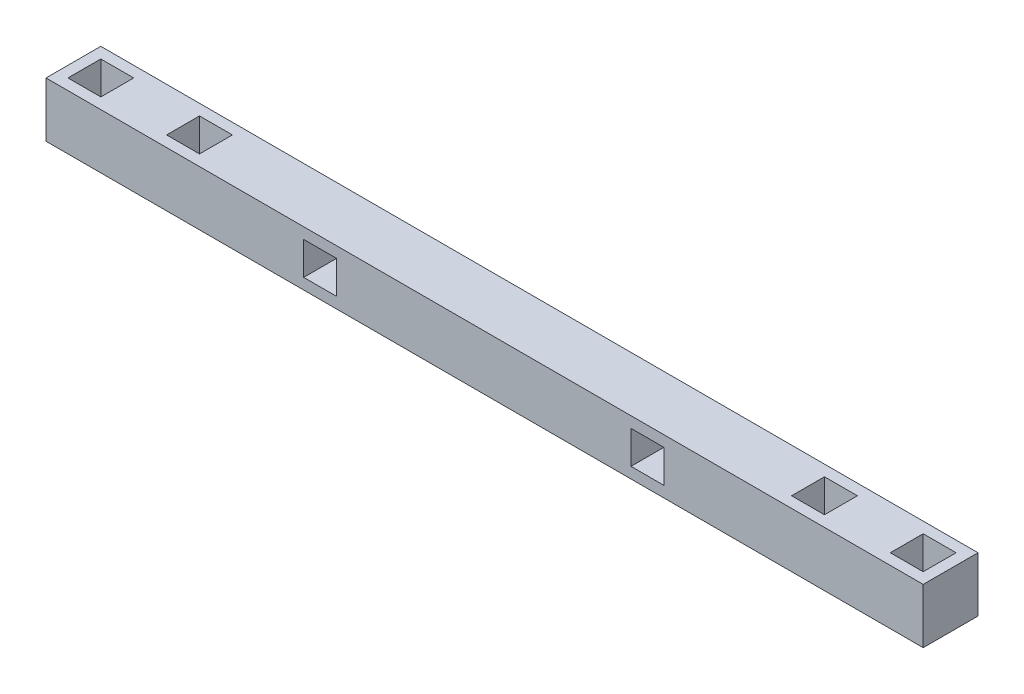
ISO-10303-21;
HEADER;
FILE_DESCRIPTION(('STEP AP214'),'2;1');
FILE_NAME('part.step','',(''),(''),'','','');
FILE_SCHEMA(('AUTOMOTIVE_DESIGN { 1 0 10303 214 1 1 1 1 }'));
ENDSEC;
DATA;
#1=APPLICATION_CONTEXT('core data for automotive mechanical design processes');
#2=APPLICATION_PROTOCOL_DEFINITION('international standard','automotive_design',2000,#1);
#3=PRODUCT_CONTEXT('',#1,'mechanical');
#4=PRODUCT('Part','Part','',(#3));
#5=PRODUCT_RELATED_PRODUCT_CATEGORY('part','',(#4));
#6=PRODUCT_DEFINITION_FORMATION('','',#4);
#7=PRODUCT_DEFINITION_CONTEXT('part definition',#1,'design');
#8=PRODUCT_DEFINITION('design','',#6,#7);
#9=PRODUCT_DEFINITION_SHAPE('','',#8);
#10=(LENGTH_UNIT() NAMED_UNIT(*) SI_UNIT(.MILLI.,.METRE.));
#11=(NAMED_UNIT(*) PLANE_ANGLE_UNIT() SI_UNIT($,.RADIAN.));
#12=(NAMED_UNIT(*) SI_UNIT($,.STERADIAN.) SOLID_ANGLE_UNIT());
#13=UNCERTAINTY_MEASURE_WITH_UNIT(LENGTH_MEASURE(1.E-05),#10,'distance_accuracy_value','');
#14=(GEOMETRIC_REPRESENTATION_CONTEXT(3) GLOBAL_UNCERTAINTY_ASSIGNED_CONTEXT((#13)) GLOBAL_UNIT_ASSIGNED_CONTEXT((#10,
#11,#12)) REPRESENTATION_CONTEXT('',''));
#15=CARTESIAN_POINT('',(0.,0.,0.));
#16=DIRECTION('',(0.,0.,1.));
#17=DIRECTION('',(1.,0.,0.));
#18=AXIS2_PLACEMENT_3D('',#15,#16,#17);
#19=CARTESIAN_POINT('',(0.,0.,5.));
#20=DIRECTION('',(0.,0.,-1.));
#21=DIRECTION('',(-1.,0.,0.));
#22=AXIS2_PLACEMENT_3D('',#19,#20,#21);
#23=PLANE('',#22);
#24=DIRECTION('',(0.,-1.,0.));
#25=VECTOR('',#24,1.);
#26=CARTESIAN_POINT('',(53.35,4.,5.));
#27=LINE('',#26,#25);
#28=CARTESIAN_POINT('',(53.35,4.,5.));
#29=VERTEX_POINT('',#28);
#30=CARTESIAN_POINT('',(53.35,1.,5.));
#31=VERTEX_POINT('',#30);
#32=EDGE_CURVE('E384',#29,#31,#27,.T.);
#33=ORIENTED_EDGE('',*,*,#32,.F.);
#34=DIRECTION('',(-1.,0.,0.));
#35=VECTOR('',#34,1.);
#36=CARTESIAN_POINT('',(53.35,4.,5.));
#37=LINE('',#36,#35);
#38=CARTESIAN_POINT('',(56.35,4.,5.));
#39=VERTEX_POINT('',#38);
#40=EDGE_CURVE('E392',#39,#29,#37,.T.);
#41=ORIENTED_EDGE('',*,*,#40,.F.);
#42=DIRECTION('',(0.,1.,0.));
#43=VECTOR('',#42,1.);
#44=CARTESIAN_POINT('',(56.35,4.,5.));
#45=LINE('',#44,#43);
#46=CARTESIAN_POINT('',(56.35,1.,5.));
#47=VERTEX_POINT('',#46);
#48=EDGE_CURVE('E389',#47,#39,#45,.T.);
#49=ORIENTED_EDGE('',*,*,#48,.F.);
#50=DIRECTION('',(1.,0.,0.));
#51=VECTOR('',#50,1.);
#52=CARTESIAN_POINT('',(53.35,1.,5.));
#53=LINE('',#52,#51);
#54=EDGE_CURVE('E386',#31,#47,#53,.T.);
#55=ORIENTED_EDGE('',*,*,#54,.F.);
#56=EDGE_LOOP('',(#33,#41,#49,#55));
#57=FACE_BOUND('',#56,.T.);
#58=DIRECTION('',(0.,-1.,0.));
#59=VECTOR('',#58,1.);
#60=CARTESIAN_POINT('',(0.,0.,5.));
#61=LINE('',#60,#59);
#62=CARTESIAN_POINT('',(0.,5.,5.));
#63=VERTEX_POINT('',#62);
#64=CARTESIAN_POINT('',(0.,0.,5.));
#65=VERTEX_POINT('',#64);
#66=EDGE_CURVE('E415',#63,#65,#61,.T.);
#67=ORIENTED_EDGE('',*,*,#66,.T.);
#68=DIRECTION('',(1.,0.,0.));
#69=VECTOR('',#68,1.);
#70=CARTESIAN_POINT('',(0.,0.,5.));
#71=LINE('',#70,#69);
#72=CARTESIAN_POINT('',(80.,0.,5.));
#73=VERTEX_POINT('',#72);
#74=EDGE_CURVE('E418',#65,#73,#71,.T.);
#75=ORIENTED_EDGE('',*,*,#74,.T.);
#76=DIRECTION('',(0.,1.,0.));
#77=VECTOR('',#76,1.);
#78=CARTESIAN_POINT('',(80.,0.,5.));
#79=LINE('',#78,#77);
#80=CARTESIAN_POINT('',(80.,5.,5.));
#81=VERTEX_POINT('',#80);
#82=EDGE_CURVE('E421',#73,#81,#79,.T.);
#83=ORIENTED_EDGE('',*,*,#82,.T.);
#84=DIRECTION('',(-1.,0.,0.));
#85=VECTOR('',#84,1.);
#86=CARTESIAN_POINT('',(0.,5.,5.));
#87=LINE('',#86,#85);
#88=EDGE_CURVE('E423',#81,#63,#87,.T.);
#89=ORIENTED_EDGE('',*,*,#88,.T.);
#90=EDGE_LOOP('',(#67,#75,#83,#89));
#91=FACE_BOUND('',#90,.T.);
#92=DIRECTION('',(0.,-1.,0.));
#93=VECTOR('',#92,1.);
#94=CARTESIAN_POINT('',(23.5,4.,5.));
#95=LINE('',#94,#93);
#96=CARTESIAN_POINT('',(23.5,4.,5.));
#97=VERTEX_POINT('',#96);
#98=CARTESIAN_POINT('',(23.5,1.,5.));
#99=VERTEX_POINT('',#98);
#100=EDGE_CURVE('E353',#97,#99,#95,.T.);
#101=ORIENTED_EDGE('',*,*,#100,.F.);
#102=DIRECTION('',(-1.,0.,0.));
#103=VECTOR('',#102,1.);
#104=CARTESIAN_POINT('',(23.5,4.,5.));
#105=LINE('',#104,#103);
#106=CARTESIAN_POINT('',(26.5,4.,5.));
#107=VERTEX_POINT('',#106);
#108=EDGE_CURVE('E361',#107,#97,#105,.T.);
#109=ORIENTED_EDGE('',*,*,#108,.F.);
#110=DIRECTION('',(0.,1.,0.));
#111=VECTOR('',#110,1.);
#112=CARTESIAN_POINT('',(26.5,4.,5.));
#113=LINE('',#112,#111);
#114=CARTESIAN_POINT('',(26.5,1.,5.));
#115=VERTEX_POINT('',#114);
#116=EDGE_CURVE('E358',#115,#107,#113,.T.);
#117=ORIENTED_EDGE('',*,*,#116,.F.);
#118=DIRECTION('',(1.,0.,0.));
#119=VECTOR('',#118,1.);
#120=CARTESIAN_POINT('',(23.5,1.,5.));
#121=LINE('',#120,#119);
#122=EDGE_CURVE('E355',#99,#115,#121,.T.);
#123=ORIENTED_EDGE('',*,*,#122,.F.);
#124=EDGE_LOOP('',(#101,#109,#117,#123));
#125=FACE_BOUND('',#124,.T.);
#126=ADVANCED_FACE('F33',(#57,#91,#125),#23,.F.);
#127=CARTESIAN_POINT('',(0.,0.,0.));
#128=DIRECTION('',(0.,0.,-1.));
#129=DIRECTION('',(-1.,0.,0.));
#130=AXIS2_PLACEMENT_3D('',#127,#128,#129);
#131=PLANE('',#130);
#132=DIRECTION('',(0.,-1.,0.));
#133=VECTOR('',#132,1.);
#134=CARTESIAN_POINT('',(0.,0.,0.));
#135=LINE('',#134,#133);
#136=CARTESIAN_POINT('',(0.,5.,0.));
#137=VERTEX_POINT('',#136);
#138=CARTESIAN_POINT('',(0.,0.,0.));
#139=VERTEX_POINT('',#138);
#140=EDGE_CURVE('E414',#137,#139,#135,.T.);
#141=ORIENTED_EDGE('',*,*,#140,.F.);
#142=DIRECTION('',(-1.,0.,0.));
#143=VECTOR('',#142,1.);
#144=CARTESIAN_POINT('',(0.,5.,0.));
#145=LINE('',#144,#143);
#146=CARTESIAN_POINT('',(80.,5.,0.));
#147=VERTEX_POINT('',#146);
#148=EDGE_CURVE('E419',#147,#137,#145,.T.);
#149=ORIENTED_EDGE('',*,*,#148,.F.);
#150=DIRECTION('',(0.,1.,0.));
#151=VECTOR('',#150,1.);
#152=CARTESIAN_POINT('',(80.,0.,0.));
#153=LINE('',#152,#151);
#154=CARTESIAN_POINT('',(80.,0.,0.));
#155=VERTEX_POINT('',#154);
#156=EDGE_CURVE('E430',#155,#147,#153,.T.);
#157=ORIENTED_EDGE('',*,*,#156,.F.);
#158=DIRECTION('',(1.,0.,0.));
#159=VECTOR('',#158,1.);
#160=CARTESIAN_POINT('',(0.,0.,0.));
#161=LINE('',#160,#159);
#162=EDGE_CURVE('E428',#139,#155,#161,.T.);
#163=ORIENTED_EDGE('',*,*,#162,.F.);
#164=EDGE_LOOP('',(#141,#149,#157,#163));
#165=FACE_BOUND('',#164,.T.);
#166=DIRECTION('',(-1.,0.,0.));
#167=VECTOR('',#166,1.);
#168=CARTESIAN_POINT('',(53.35,4.,0.));
#169=LINE('',#168,#167);
#170=CARTESIAN_POINT('',(56.35,4.,0.));
#171=VERTEX_POINT('',#170);
#172=CARTESIAN_POINT('',(53.35,4.,0.));
#173=VERTEX_POINT('',#172);
#174=EDGE_CURVE('E387',#171,#173,#169,.T.);
#175=ORIENTED_EDGE('',*,*,#174,.T.);
#176=DIRECTION('',(0.,-1.,0.));
#177=VECTOR('',#176,1.);
#178=CARTESIAN_POINT('',(53.35,4.,0.));
#179=LINE('',#178,#177);
#180=CARTESIAN_POINT('',(53.35,1.,0.));
#181=VERTEX_POINT('',#180);
#182=EDGE_CURVE('E383',#173,#181,#179,.T.);
#183=ORIENTED_EDGE('',*,*,#182,.T.);
#184=DIRECTION('',(1.,0.,0.));
#185=VECTOR('',#184,1.);
#186=CARTESIAN_POINT('',(53.35,1.,0.));
#187=LINE('',#186,#185);
#188=CARTESIAN_POINT('',(56.35,1.,0.));
#189=VERTEX_POINT('',#188);
#190=EDGE_CURVE('E397',#181,#189,#187,.T.);
#191=ORIENTED_EDGE('',*,*,#190,.T.);
#192=DIRECTION('',(0.,1.,0.));
#193=VECTOR('',#192,1.);
#194=CARTESIAN_POINT('',(56.35,4.,0.));
#195=LINE('',#194,#193);
#196=EDGE_CURVE('E400',#189,#171,#195,.T.);
#197=ORIENTED_EDGE('',*,*,#196,.T.);
#198=EDGE_LOOP('',(#175,#183,#191,#197));
#199=FACE_BOUND('',#198,.T.);
#200=DIRECTION('',(-1.,0.,0.));
#201=VECTOR('',#200,1.);
#202=CARTESIAN_POINT('',(23.5,4.,0.));
#203=LINE('',#202,#201);
#204=CARTESIAN_POINT('',(26.5,4.,0.));
#205=VERTEX_POINT('',#204);
#206=CARTESIAN_POINT('',(23.5,4.,0.));
#207=VERTEX_POINT('',#206);
#208=EDGE_CURVE('E356',#205,#207,#203,.T.);
#209=ORIENTED_EDGE('',*,*,#208,.T.);
#210=DIRECTION('',(0.,-1.,0.));
#211=VECTOR('',#210,1.);
#212=CARTESIAN_POINT('',(23.5,4.,0.));
#213=LINE('',#212,#211);
#214=CARTESIAN_POINT('',(23.5,1.,0.));
#215=VERTEX_POINT('',#214);
#216=EDGE_CURVE('E256',#207,#215,#213,.T.);
#217=ORIENTED_EDGE('',*,*,#216,.T.);
#218=DIRECTION('',(1.,0.,0.));
#219=VECTOR('',#218,1.);
#220=CARTESIAN_POINT('',(23.5,1.,0.));
#221=LINE('',#220,#219);
#222=CARTESIAN_POINT('',(26.5,1.,0.));
#223=VERTEX_POINT('',#222);
#224=EDGE_CURVE('E366',#215,#223,#221,.T.);
#225=ORIENTED_EDGE('',*,*,#224,.T.);
#226=DIRECTION('',(0.,1.,0.));
#227=VECTOR('',#226,1.);
#228=CARTESIAN_POINT('',(26.5,4.,0.));
#229=LINE('',#228,#227);
#230=EDGE_CURVE('E369',#223,#205,#229,.T.);
#231=ORIENTED_EDGE('',*,*,#230,.T.);
#232=EDGE_LOOP('',(#209,#217,#225,#231));
#233=FACE_BOUND('',#232,.T.);
#234=ADVANCED_FACE('F448',(#165,#199,#233),#131,.T.);
#235=CARTESIAN_POINT('',(0.,0.,5.));
#236=DIRECTION('',(1.,0.,0.));
#237=DIRECTION('',(0.,0.,-1.));
#238=AXIS2_PLACEMENT_3D('',#235,#236,#237);
#239=PLANE('',#238);
#240=ORIENTED_EDGE('',*,*,#140,.T.);
#241=DIRECTION('',(0.,0.,-1.));
#242=VECTOR('',#241,1.);
#243=CARTESIAN_POINT('',(0.,0.,5.));
#244=LINE('',#243,#242);
#245=EDGE_CURVE('E11',#65,#139,#244,.T.);
#246=ORIENTED_EDGE('',*,*,#245,.F.);
#247=ORIENTED_EDGE('',*,*,#66,.F.);
#248=DIRECTION('',(0.,0.,-1.));
#249=VECTOR('',#248,1.);
#250=CARTESIAN_POINT('',(0.,5.,5.));
#251=LINE('',#250,#249);
#252=EDGE_CURVE('E425',#63,#137,#251,.T.);
#253=ORIENTED_EDGE('',*,*,#252,.T.);
#254=EDGE_LOOP('',(#240,#246,#247,#253));
#255=FACE_BOUND('',#254,.T.);
#256=ADVANCED_FACE('F35',(#255),#239,.F.);
#257=CARTESIAN_POINT('',(0.,0.,5.));
#258=DIRECTION('',(0.,1.,0.));
#259=DIRECTION('',(0.,0.,1.));
#260=AXIS2_PLACEMENT_3D('',#257,#258,#259);
#261=PLANE('',#260);
#262=DIRECTION('',(-1.,0.,0.));
#263=VECTOR('',#262,1.);
#264=CARTESIAN_POINT('',(76.,0.,1.));
#265=LINE('',#264,#263);
#266=CARTESIAN_POINT('',(79.,0.,1.));
#267=VERTEX_POINT('',#266);
#268=CARTESIAN_POINT('',(76.,0.,1.));
#269=VERTEX_POINT('',#268);
#270=EDGE_CURVE('E230',#267,#269,#265,.T.);
#271=ORIENTED_EDGE('',*,*,#270,.T.);
#272=DIRECTION('',(0.,0.,1.));
#273=VECTOR('',#272,1.);
#274=CARTESIAN_POINT('',(76.,0.,1.));
#275=LINE('',#274,#273);
#276=CARTESIAN_POINT('',(76.,0.,4.));
#277=VERTEX_POINT('',#276);
#278=EDGE_CURVE('E222',#269,#277,#275,.T.);
#279=ORIENTED_EDGE('',*,*,#278,.T.);
#280=DIRECTION('',(1.,0.,0.));
#281=VECTOR('',#280,1.);
#282=CARTESIAN_POINT('',(76.,0.,4.));
#283=LINE('',#282,#281);
#284=CARTESIAN_POINT('',(79.,0.,4.));
#285=VERTEX_POINT('',#284);
#286=EDGE_CURVE('E233',#277,#285,#283,.T.);
#287=ORIENTED_EDGE('',*,*,#286,.T.);
#288=DIRECTION('',(0.,0.,-1.));
#289=VECTOR('',#288,1.);
#290=CARTESIAN_POINT('',(79.,0.,1.));
#291=LINE('',#290,#289);
#292=EDGE_CURVE('E48',#285,#267,#291,.T.);
#293=ORIENTED_EDGE('',*,*,#292,.T.);
#294=EDGE_LOOP('',(#271,#279,#287,#293));
#295=FACE_BOUND('',#294,.T.);
#296=DIRECTION('',(-1.,0.,0.));
#297=VECTOR('',#296,1.);
#298=CARTESIAN_POINT('',(1.,0.,1.));
#299=LINE('',#298,#297);
#300=CARTESIAN_POINT('',(4.,0.,0.999999999999991));
#301=VERTEX_POINT('',#300);
#302=CARTESIAN_POINT('',(1.,0.,1.));
#303=VERTEX_POINT('',#302);
#304=EDGE_CURVE('E268',#301,#303,#299,.T.);
#305=ORIENTED_EDGE('',*,*,#304,.T.);
#306=DIRECTION('',(0.,0.,1.));
#307=VECTOR('',#306,1.);
#308=CARTESIAN_POINT('',(1.,0.,1.));
#309=LINE('',#308,#307);
#310=CARTESIAN_POINT('',(1.,0.,4.));
#311=VERTEX_POINT('',#310);
#312=EDGE_CURVE('E260',#303,#311,#309,.T.);
#313=ORIENTED_EDGE('',*,*,#312,.T.);
#314=DIRECTION('',(1.,0.,0.));
#315=VECTOR('',#314,1.);
#316=CARTESIAN_POINT('',(1.,0.,4.));
#317=LINE('',#316,#315);
#318=CARTESIAN_POINT('',(4.,0.,4.));
#319=VERTEX_POINT('',#318);
#320=EDGE_CURVE('E263',#311,#319,#317,.T.);
#321=ORIENTED_EDGE('',*,*,#320,.T.);
#322=DIRECTION('',(0.,0.,-1.));
#323=VECTOR('',#322,1.);
#324=CARTESIAN_POINT('',(4.,0.,0.999999999999991));
#325=LINE('',#324,#323);
#326=EDGE_CURVE('E56',#319,#301,#325,.T.);
#327=ORIENTED_EDGE('',*,*,#326,.T.);
#328=EDGE_LOOP('',(#305,#313,#321,#327));
#329=FACE_BOUND('',#328,.T.);
#330=DIRECTION('',(-1.,0.,0.));
#331=VECTOR('',#330,1.);
#332=CARTESIAN_POINT('',(10.,0.,1.));
#333=LINE('',#332,#331);
#334=CARTESIAN_POINT('',(13.,0.,1.));
#335=VERTEX_POINT('',#334);
#336=CARTESIAN_POINT('',(10.,0.,1.));
#337=VERTEX_POINT('',#336);
#338=EDGE_CURVE('E300',#335,#337,#333,.T.);
#339=ORIENTED_EDGE('',*,*,#338,.T.);
#340=DIRECTION('',(0.,0.,1.));
#341=VECTOR('',#340,1.);
#342=CARTESIAN_POINT('',(10.,0.,1.));
#343=LINE('',#342,#341);
#344=CARTESIAN_POINT('',(10.,0.,4.));
#345=VERTEX_POINT('',#344);
#346=EDGE_CURVE('E290',#337,#345,#343,.T.);
#347=ORIENTED_EDGE('',*,*,#346,.T.);
#348=DIRECTION('',(1.,0.,0.));
#349=VECTOR('',#348,1.);
#350=CARTESIAN_POINT('',(10.,0.,4.));
#351=LINE('',#350,#349);
#352=CARTESIAN_POINT('',(13.,0.,4.));
#353=VERTEX_POINT('',#352);
#354=EDGE_CURVE('E293',#345,#353,#351,.T.);
#355=ORIENTED_EDGE('',*,*,#354,.T.);
#356=DIRECTION('',(0.,0.,-1.));
#357=VECTOR('',#356,1.);
#358=CARTESIAN_POINT('',(13.,0.,1.));
#359=LINE('',#358,#357);
#360=EDGE_CURVE('E297',#353,#335,#359,.T.);
#361=ORIENTED_EDGE('',*,*,#360,.T.);
#362=EDGE_LOOP('',(#339,#347,#355,#361));
#363=FACE_BOUND('',#362,.T.);
#364=DIRECTION('',(-1.,0.,0.));
#365=VECTOR('',#364,1.);
#366=CARTESIAN_POINT('',(67.,0.,1.));
#367=LINE('',#366,#365);
#368=CARTESIAN_POINT('',(70.,0.,1.));
#369=VERTEX_POINT('',#368);
#370=CARTESIAN_POINT('',(67.,0.,1.));
#371=VERTEX_POINT('',#370);
#372=EDGE_CURVE('E332',#369,#371,#367,.T.);
#373=ORIENTED_EDGE('',*,*,#372,.T.);
#374=DIRECTION('',(0.,0.,1.));
#375=VECTOR('',#374,1.);
#376=CARTESIAN_POINT('',(67.,0.,1.));
#377=LINE('',#376,#375);
#378=CARTESIAN_POINT('',(67.,0.,4.));
#379=VERTEX_POINT('',#378);
#380=EDGE_CURVE('E322',#371,#379,#377,.T.);
#381=ORIENTED_EDGE('',*,*,#380,.T.);
#382=DIRECTION('',(1.,0.,0.));
#383=VECTOR('',#382,1.);
#384=CARTESIAN_POINT('',(67.,0.,4.));
#385=LINE('',#384,#383);
#386=CARTESIAN_POINT('',(70.,0.,4.));
#387=VERTEX_POINT('',#386);
#388=EDGE_CURVE('E325',#379,#387,#385,.T.);
#389=ORIENTED_EDGE('',*,*,#388,.T.);
#390=DIRECTION('',(0.,0.,-1.));
#391=VECTOR('',#390,1.);
#392=CARTESIAN_POINT('',(70.,0.,1.));
#393=LINE('',#392,#391);
#394=EDGE_CURVE('E329',#387,#369,#393,.T.);
#395=ORIENTED_EDGE('',*,*,#394,.T.);
#396=EDGE_LOOP('',(#373,#381,#389,#395));
#397=FACE_BOUND('',#396,.T.);
#398=ORIENTED_EDGE('',*,*,#162,.T.);
#399=DIRECTION('',(0.,0.,-1.));
#400=VECTOR('',#399,1.);
#401=CARTESIAN_POINT('',(80.,0.,5.));
#402=LINE('',#401,#400);
#403=EDGE_CURVE('E41',#73,#155,#402,.T.);
#404=ORIENTED_EDGE('',*,*,#403,.F.);
#405=ORIENTED_EDGE('',*,*,#74,.F.);
#406=ORIENTED_EDGE('',*,*,#245,.T.);
#407=EDGE_LOOP('',(#398,#404,#405,#406));
#408=FACE_BOUND('',#407,.T.);
#409=ADVANCED_FACE('F237',(#295,#329,#363,#397,#408),#261,.F.);
#410=CARTESIAN_POINT('',(80.,0.,5.));
#411=DIRECTION('',(-1.,0.,0.));
#412=DIRECTION('',(0.,0.,1.));
#413=AXIS2_PLACEMENT_3D('',#410,#411,#412);
#414=PLANE('',#413);
#415=ORIENTED_EDGE('',*,*,#156,.T.);
#416=DIRECTION('',(0.,0.,-1.));
#417=VECTOR('',#416,1.);
#418=CARTESIAN_POINT('',(80.,5.,5.));
#419=LINE('',#418,#417);
#420=EDGE_CURVE('E435',#81,#147,#419,.T.);
#421=ORIENTED_EDGE('',*,*,#420,.F.);
#422=ORIENTED_EDGE('',*,*,#82,.F.);
#423=ORIENTED_EDGE('',*,*,#403,.T.);
#424=EDGE_LOOP('',(#415,#421,#422,#423));
#425=FACE_BOUND('',#424,.T.);
#426=ADVANCED_FACE('F442',(#425),#414,.F.);
#427=CARTESIAN_POINT('',(0.,5.,5.));
#428=DIRECTION('',(0.,-1.,0.));
#429=DIRECTION('',(0.,0.,-1.));
#430=AXIS2_PLACEMENT_3D('',#427,#428,#429);
#431=PLANE('',#430);
#432=DIRECTION('',(1.,0.,0.));
#433=VECTOR('',#432,1.);
#434=CARTESIAN_POINT('',(76.,5.,4.));
#435=LINE('',#434,#433);
#436=CARTESIAN_POINT('',(76.,5.,4.));
#437=VERTEX_POINT('',#436);
#438=CARTESIAN_POINT('',(79.,5.,4.));
#439=VERTEX_POINT('',#438);
#440=EDGE_CURVE('E249',#437,#439,#435,.T.);
#441=ORIENTED_EDGE('',*,*,#440,.F.);
#442=DIRECTION('',(0.,0.,1.));
#443=VECTOR('',#442,1.);
#444=CARTESIAN_POINT('',(76.,5.,1.));
#445=LINE('',#444,#443);
#446=CARTESIAN_POINT('',(76.,5.,1.));
#447=VERTEX_POINT('',#446);
#448=EDGE_CURVE('E225',#447,#437,#445,.T.);
#449=ORIENTED_EDGE('',*,*,#448,.F.);
#450=DIRECTION('',(-1.,0.,0.));
#451=VECTOR('',#450,1.);
#452=CARTESIAN_POINT('',(76.,5.,1.));
#453=LINE('',#452,#451);
#454=CARTESIAN_POINT('',(79.,5.,1.));
#455=VERTEX_POINT('',#454);
#456=EDGE_CURVE('E240',#455,#447,#453,.T.);
#457=ORIENTED_EDGE('',*,*,#456,.F.);
#458=DIRECTION('',(0.,0.,-1.));
#459=VECTOR('',#458,1.);
#460=CARTESIAN_POINT('',(79.,5.,1.));
#461=LINE('',#460,#459);
#462=EDGE_CURVE('E243',#439,#455,#461,.T.);
#463=ORIENTED_EDGE('',*,*,#462,.F.);
#464=EDGE_LOOP('',(#441,#449,#457,#463));
#465=FACE_BOUND('',#464,.T.);
#466=DIRECTION('',(1.,0.,0.));
#467=VECTOR('',#466,1.);
#468=CARTESIAN_POINT('',(1.,5.,4.));
#469=LINE('',#468,#467);
#470=CARTESIAN_POINT('',(1.,5.,4.));
#471=VERTEX_POINT('',#470);
#472=CARTESIAN_POINT('',(4.,5.,4.));
#473=VERTEX_POINT('',#472);
#474=EDGE_CURVE('E274',#471,#473,#469,.T.);
#475=ORIENTED_EDGE('',*,*,#474,.F.);
#476=DIRECTION('',(0.,0.,1.));
#477=VECTOR('',#476,1.);
#478=CARTESIAN_POINT('',(1.,5.,1.));
#479=LINE('',#478,#477);
#480=CARTESIAN_POINT('',(1.,5.,1.));
#481=VERTEX_POINT('',#480);
#482=EDGE_CURVE('E272',#481,#471,#479,.T.);
#483=ORIENTED_EDGE('',*,*,#482,.F.);
#484=DIRECTION('',(-1.,0.,0.));
#485=VECTOR('',#484,1.);
#486=CARTESIAN_POINT('',(1.,5.,1.));
#487=LINE('',#486,#485);
#488=CARTESIAN_POINT('',(4.,5.,0.999999999999991));
#489=VERTEX_POINT('',#488);
#490=EDGE_CURVE('E264',#489,#481,#487,.T.);
#491=ORIENTED_EDGE('',*,*,#490,.F.);
#492=DIRECTION('',(0.,0.,-1.));
#493=VECTOR('',#492,1.);
#494=CARTESIAN_POINT('',(4.,5.,0.999999999999991));
#495=LINE('',#494,#493);
#496=EDGE_CURVE('E278',#473,#489,#495,.T.);
#497=ORIENTED_EDGE('',*,*,#496,.F.);
#498=EDGE_LOOP('',(#475,#483,#491,#497));
#499=FACE_BOUND('',#498,.T.);
#500=DIRECTION('',(1.,0.,0.));
#501=VECTOR('',#500,1.);
#502=CARTESIAN_POINT('',(10.,5.,4.));
#503=LINE('',#502,#501);
#504=CARTESIAN_POINT('',(10.,5.,4.));
#505=VERTEX_POINT('',#504);
#506=CARTESIAN_POINT('',(13.,5.,4.));
#507=VERTEX_POINT('',#506);
#508=EDGE_CURVE('E306',#505,#507,#503,.T.);
#509=ORIENTED_EDGE('',*,*,#508,.F.);
#510=DIRECTION('',(0.,0.,1.));
#511=VECTOR('',#510,1.);
#512=CARTESIAN_POINT('',(10.,5.,1.));
#513=LINE('',#512,#511);
#514=CARTESIAN_POINT('',(10.,5.,1.));
#515=VERTEX_POINT('',#514);
#516=EDGE_CURVE('E304',#515,#505,#513,.T.);
#517=ORIENTED_EDGE('',*,*,#516,.F.);
#518=DIRECTION('',(-1.,0.,0.));
#519=VECTOR('',#518,1.);
#520=CARTESIAN_POINT('',(10.,5.,1.));
#521=LINE('',#520,#519);
#522=CARTESIAN_POINT('',(13.,5.,1.));
#523=VERTEX_POINT('',#522);
#524=EDGE_CURVE('E294',#523,#515,#521,.T.);
#525=ORIENTED_EDGE('',*,*,#524,.F.);
#526=DIRECTION('',(0.,0.,-1.));
#527=VECTOR('',#526,1.);
#528=CARTESIAN_POINT('',(13.,5.,1.));
#529=LINE('',#528,#527);
#530=EDGE_CURVE('E310',#507,#523,#529,.T.);
#531=ORIENTED_EDGE('',*,*,#530,.F.);
#532=EDGE_LOOP('',(#509,#517,#525,#531));
#533=FACE_BOUND('',#532,.T.);
#534=DIRECTION('',(1.,0.,0.));
#535=VECTOR('',#534,1.);
#536=CARTESIAN_POINT('',(67.,5.,4.));
#537=LINE('',#536,#535);
#538=CARTESIAN_POINT('',(67.,5.,4.));
#539=VERTEX_POINT('',#538);
#540=CARTESIAN_POINT('',(70.,5.,4.));
#541=VERTEX_POINT('',#540);
#542=EDGE_CURVE('E338',#539,#541,#537,.T.);
#543=ORIENTED_EDGE('',*,*,#542,.F.);
#544=DIRECTION('',(0.,0.,1.));
#545=VECTOR('',#544,1.);
#546=CARTESIAN_POINT('',(67.,5.,1.));
#547=LINE('',#546,#545);
#548=CARTESIAN_POINT('',(67.,5.,1.));
#549=VERTEX_POINT('',#548);
#550=EDGE_CURVE('E336',#549,#539,#547,.T.);
#551=ORIENTED_EDGE('',*,*,#550,.F.);
#552=DIRECTION('',(-1.,0.,0.));
#553=VECTOR('',#552,1.);
#554=CARTESIAN_POINT('',(67.,5.,1.));
#555=LINE('',#554,#553);
#556=CARTESIAN_POINT('',(70.,5.,1.));
#557=VERTEX_POINT('',#556);
#558=EDGE_CURVE('E326',#557,#549,#555,.T.);
#559=ORIENTED_EDGE('',*,*,#558,.F.);
#560=DIRECTION('',(0.,0.,-1.));
#561=VECTOR('',#560,1.);
#562=CARTESIAN_POINT('',(70.,5.,1.));
#563=LINE('',#562,#561);
#564=EDGE_CURVE('E341',#541,#557,#563,.T.);
#565=ORIENTED_EDGE('',*,*,#564,.F.);
#566=EDGE_LOOP('',(#543,#551,#559,#565));
#567=FACE_BOUND('',#566,.T.);
#568=ORIENTED_EDGE('',*,*,#148,.T.);
#569=ORIENTED_EDGE('',*,*,#252,.F.);
#570=ORIENTED_EDGE('',*,*,#88,.F.);
#571=ORIENTED_EDGE('',*,*,#420,.T.);
#572=EDGE_LOOP('',(#568,#569,#570,#571));
#573=FACE_BOUND('',#572,.T.);
#574=ADVANCED_FACE('F452',(#465,#499,#533,#567,#573),#431,.F.);
#575=CARTESIAN_POINT('',(53.35,4.,5.));
#576=DIRECTION('',(1.,0.,0.));
#577=DIRECTION('',(0.,0.,-1.));
#578=AXIS2_PLACEMENT_3D('',#575,#576,#577);
#579=PLANE('',#578);
#580=ORIENTED_EDGE('',*,*,#182,.F.);
#581=DIRECTION('',(0.,0.,-1.));
#582=VECTOR('',#581,1.);
#583=CARTESIAN_POINT('',(53.35,4.,5.));
#584=LINE('',#583,#582);
#585=EDGE_CURVE('E394',#29,#173,#584,.T.);
#586=ORIENTED_EDGE('',*,*,#585,.F.);
#587=ORIENTED_EDGE('',*,*,#32,.T.);
#588=DIRECTION('',(0.,0.,-1.));
#589=VECTOR('',#588,1.);
#590=CARTESIAN_POINT('',(53.35,1.,5.));
#591=LINE('',#590,#589);
#592=EDGE_CURVE('E411',#31,#181,#591,.T.);
#593=ORIENTED_EDGE('',*,*,#592,.T.);
#594=EDGE_LOOP('',(#580,#586,#587,#593));
#595=FACE_BOUND('',#594,.T.);
#596=ADVANCED_FACE('F474',(#595),#579,.T.);
#597=CARTESIAN_POINT('',(53.35,1.,5.));
#598=DIRECTION('',(0.,1.,0.));
#599=DIRECTION('',(-1.,0.,0.));
#600=AXIS2_PLACEMENT_3D('',#597,#598,#599);
#601=PLANE('',#600);
#602=ORIENTED_EDGE('',*,*,#190,.F.);
#603=ORIENTED_EDGE('',*,*,#592,.F.);
#604=ORIENTED_EDGE('',*,*,#54,.T.);
#605=DIRECTION('',(0.,0.,-1.));
#606=VECTOR('',#605,1.);
#607=CARTESIAN_POINT('',(56.35,1.,5.));
#608=LINE('',#607,#606);
#609=EDGE_CURVE('E409',#47,#189,#608,.T.);
#610=ORIENTED_EDGE('',*,*,#609,.T.);
#611=EDGE_LOOP('',(#602,#603,#604,#610));
#612=FACE_BOUND('',#611,.T.);
#613=ADVANCED_FACE('F482',(#612),#601,.T.);
#614=CARTESIAN_POINT('',(56.35,4.,5.));
#615=DIRECTION('',(-1.,0.,0.));
#616=DIRECTION('',(0.,0.,1.));
#617=AXIS2_PLACEMENT_3D('',#614,#615,#616);
#618=PLANE('',#617);
#619=ORIENTED_EDGE('',*,*,#196,.F.);
#620=ORIENTED_EDGE('',*,*,#609,.F.);
#621=ORIENTED_EDGE('',*,*,#48,.T.);
#622=DIRECTION('',(0.,0.,-1.));
#623=VECTOR('',#622,1.);
#624=CARTESIAN_POINT('',(56.35,4.,5.));
#625=LINE('',#624,#623);
#626=EDGE_CURVE('E407',#39,#171,#625,.T.);
#627=ORIENTED_EDGE('',*,*,#626,.T.);
#628=EDGE_LOOP('',(#619,#620,#621,#627));
#629=FACE_BOUND('',#628,.T.);
#630=ADVANCED_FACE('F543',(#629),#618,.T.);
#631=CARTESIAN_POINT('',(53.35,4.,5.));
#632=DIRECTION('',(0.,-1.,0.));
#633=DIRECTION('',(0.,0.,-1.));
#634=AXIS2_PLACEMENT_3D('',#631,#632,#633);
#635=PLANE('',#634);
#636=ORIENTED_EDGE('',*,*,#174,.F.);
#637=ORIENTED_EDGE('',*,*,#626,.F.);
#638=ORIENTED_EDGE('',*,*,#40,.T.);
#639=ORIENTED_EDGE('',*,*,#585,.T.);
#640=EDGE_LOOP('',(#636,#637,#638,#639));
#641=FACE_BOUND('',#640,.T.);
#642=ADVANCED_FACE('F539',(#641),#635,.T.);
#643=CARTESIAN_POINT('',(23.5,4.,5.));
#644=DIRECTION('',(1.,0.,0.));
#645=DIRECTION('',(0.,0.,-1.));
#646=AXIS2_PLACEMENT_3D('',#643,#644,#645);
#647=PLANE('',#646);
#648=ORIENTED_EDGE('',*,*,#216,.F.);
#649=DIRECTION('',(0.,0.,-1.));
#650=VECTOR('',#649,1.);
#651=CARTESIAN_POINT('',(23.5,4.,5.));
#652=LINE('',#651,#650);
#653=EDGE_CURVE('E363',#97,#207,#652,.T.);
#654=ORIENTED_EDGE('',*,*,#653,.F.);
#655=ORIENTED_EDGE('',*,*,#100,.T.);
#656=DIRECTION('',(0.,0.,-1.));
#657=VECTOR('',#656,1.);
#658=CARTESIAN_POINT('',(23.5,1.,5.));
#659=LINE('',#658,#657);
#660=EDGE_CURVE('E380',#99,#215,#659,.T.);
#661=ORIENTED_EDGE('',*,*,#660,.T.);
#662=EDGE_LOOP('',(#648,#654,#655,#661));
#663=FACE_BOUND('',#662,.T.);
#664=ADVANCED_FACE('F535',(#663),#647,.T.);
#665=CARTESIAN_POINT('',(23.5,1.,5.));
#666=DIRECTION('',(0.,1.,0.));
#667=DIRECTION('',(-1.,0.,0.));
#668=AXIS2_PLACEMENT_3D('',#665,#666,#667);
#669=PLANE('',#668);
#670=ORIENTED_EDGE('',*,*,#224,.F.);
#671=ORIENTED_EDGE('',*,*,#660,.F.);
#672=ORIENTED_EDGE('',*,*,#122,.T.);
#673=DIRECTION('',(0.,0.,-1.));
#674=VECTOR('',#673,1.);
#675=CARTESIAN_POINT('',(26.5,1.,5.));
#676=LINE('',#675,#674);
#677=EDGE_CURVE('E378',#115,#223,#676,.T.);
#678=ORIENTED_EDGE('',*,*,#677,.T.);
#679=EDGE_LOOP('',(#670,#671,#672,#678));
#680=FACE_BOUND('',#679,.T.);
#681=ADVANCED_FACE('F531',(#680),#669,.T.);
#682=CARTESIAN_POINT('',(26.5,4.,5.));
#683=DIRECTION('',(-1.,0.,0.));
#684=DIRECTION('',(0.,0.,1.));
#685=AXIS2_PLACEMENT_3D('',#682,#683,#684);
#686=PLANE('',#685);
#687=ORIENTED_EDGE('',*,*,#230,.F.);
#688=ORIENTED_EDGE('',*,*,#677,.F.);
#689=ORIENTED_EDGE('',*,*,#116,.T.);
#690=DIRECTION('',(0.,0.,-1.));
#691=VECTOR('',#690,1.);
#692=CARTESIAN_POINT('',(26.5,4.,5.));
#693=LINE('',#692,#691);
#694=EDGE_CURVE('E376',#107,#205,#693,.T.);
#695=ORIENTED_EDGE('',*,*,#694,.T.);
#696=EDGE_LOOP('',(#687,#688,#689,#695));
#697=FACE_BOUND('',#696,.T.);
#698=ADVANCED_FACE('F527',(#697),#686,.T.);
#699=CARTESIAN_POINT('',(23.5,4.,5.));
#700=DIRECTION('',(0.,-1.,0.));
#701=DIRECTION('',(0.,0.,-1.));
#702=AXIS2_PLACEMENT_3D('',#699,#700,#701);
#703=PLANE('',#702);
#704=ORIENTED_EDGE('',*,*,#208,.F.);
#705=ORIENTED_EDGE('',*,*,#694,.F.);
#706=ORIENTED_EDGE('',*,*,#108,.T.);
#707=ORIENTED_EDGE('',*,*,#653,.T.);
#708=EDGE_LOOP('',(#704,#705,#706,#707));
#709=FACE_BOUND('',#708,.T.);
#710=ADVANCED_FACE('F524',(#709),#703,.T.);
#711=CARTESIAN_POINT('',(67.,0.,1.));
#712=DIRECTION('',(-1.,0.,0.));
#713=DIRECTION('',(0.,0.,1.));
#714=AXIS2_PLACEMENT_3D('',#711,#712,#713);
#715=PLANE('',#714);
#716=ORIENTED_EDGE('',*,*,#550,.T.);
#717=DIRECTION('',(0.,1.,0.));
#718=VECTOR('',#717,1.);
#719=CARTESIAN_POINT('',(67.,0.,4.));
#720=LINE('',#719,#718);
#721=EDGE_CURVE('E335',#379,#539,#720,.T.);
#722=ORIENTED_EDGE('',*,*,#721,.F.);
#723=ORIENTED_EDGE('',*,*,#380,.F.);
#724=DIRECTION('',(0.,1.,0.));
#725=VECTOR('',#724,1.);
#726=CARTESIAN_POINT('',(67.,0.,1.));
#727=LINE('',#726,#725);
#728=EDGE_CURVE('E307',#371,#549,#727,.T.);
#729=ORIENTED_EDGE('',*,*,#728,.T.);
#730=EDGE_LOOP('',(#716,#722,#723,#729));
#731=FACE_BOUND('',#730,.T.);
#732=ADVANCED_FACE('F504',(#731),#715,.F.);
#733=CARTESIAN_POINT('',(67.,0.,1.));
#734=DIRECTION('',(0.,0.,-1.));
#735=DIRECTION('',(-1.,0.,0.));
#736=AXIS2_PLACEMENT_3D('',#733,#734,#735);
#737=PLANE('',#736);
#738=ORIENTED_EDGE('',*,*,#558,.T.);
#739=ORIENTED_EDGE('',*,*,#728,.F.);
#740=ORIENTED_EDGE('',*,*,#372,.F.);
#741=DIRECTION('',(0.,1.,0.));
#742=VECTOR('',#741,1.);
#743=CARTESIAN_POINT('',(70.,0.,1.));
#744=LINE('',#743,#742);
#745=EDGE_CURVE('E347',#369,#557,#744,.T.);
#746=ORIENTED_EDGE('',*,*,#745,.T.);
#747=EDGE_LOOP('',(#738,#739,#740,#746));
#748=FACE_BOUND('',#747,.T.);
#749=ADVANCED_FACE('F507',(#748),#737,.F.);
#750=CARTESIAN_POINT('',(70.,0.,1.));
#751=DIRECTION('',(1.,0.,0.));
#752=DIRECTION('',(0.,0.,-1.));
#753=AXIS2_PLACEMENT_3D('',#750,#751,#752);
#754=PLANE('',#753);
#755=ORIENTED_EDGE('',*,*,#564,.T.);
#756=ORIENTED_EDGE('',*,*,#745,.F.);
#757=ORIENTED_EDGE('',*,*,#394,.F.);
#758=DIRECTION('',(0.,1.,0.));
#759=VECTOR('',#758,1.);
#760=CARTESIAN_POINT('',(70.,0.,4.));
#761=LINE('',#760,#759);
#762=EDGE_CURVE('E349',#387,#541,#761,.T.);
#763=ORIENTED_EDGE('',*,*,#762,.T.);
#764=EDGE_LOOP('',(#755,#756,#757,#763));
#765=FACE_BOUND('',#764,.T.);
#766=ADVANCED_FACE('F509',(#765),#754,.F.);
#767=CARTESIAN_POINT('',(67.,0.,4.));
#768=DIRECTION('',(0.,0.,1.));
#769=DIRECTION('',(1.,0.,0.));
#770=AXIS2_PLACEMENT_3D('',#767,#768,#769);
#771=PLANE('',#770);
#772=ORIENTED_EDGE('',*,*,#542,.T.);
#773=ORIENTED_EDGE('',*,*,#762,.F.);
#774=ORIENTED_EDGE('',*,*,#388,.F.);
#775=ORIENTED_EDGE('',*,*,#721,.T.);
#776=EDGE_LOOP('',(#772,#773,#774,#775));
#777=FACE_BOUND('',#776,.T.);
#778=ADVANCED_FACE('F500',(#777),#771,.F.);
#779=CARTESIAN_POINT('',(10.,0.,1.));
#780=DIRECTION('',(-1.,0.,0.));
#781=DIRECTION('',(0.,0.,1.));
#782=AXIS2_PLACEMENT_3D('',#779,#780,#781);
#783=PLANE('',#782);
#784=ORIENTED_EDGE('',*,*,#516,.T.);
#785=DIRECTION('',(0.,1.,0.));
#786=VECTOR('',#785,1.);
#787=CARTESIAN_POINT('',(10.,0.,4.));
#788=LINE('',#787,#786);
#789=EDGE_CURVE('E303',#345,#505,#788,.T.);
#790=ORIENTED_EDGE('',*,*,#789,.F.);
#791=ORIENTED_EDGE('',*,*,#346,.F.);
#792=DIRECTION('',(0.,1.,0.));
#793=VECTOR('',#792,1.);
#794=CARTESIAN_POINT('',(10.,0.,1.));
#795=LINE('',#794,#793);
#796=EDGE_CURVE('E275',#337,#515,#795,.T.);
#797=ORIENTED_EDGE('',*,*,#796,.T.);
#798=EDGE_LOOP('',(#784,#790,#791,#797));
#799=FACE_BOUND('',#798,.T.);
#800=ADVANCED_FACE('F517',(#799),#783,.F.);
#801=CARTESIAN_POINT('',(10.,0.,1.));
#802=DIRECTION('',(0.,0.,-1.));
#803=DIRECTION('',(-1.,0.,0.));
#804=AXIS2_PLACEMENT_3D('',#801,#802,#803);
#805=PLANE('',#804);
#806=ORIENTED_EDGE('',*,*,#524,.T.);
#807=ORIENTED_EDGE('',*,*,#796,.F.);
#808=ORIENTED_EDGE('',*,*,#338,.F.);
#809=DIRECTION('',(0.,1.,0.));
#810=VECTOR('',#809,1.);
#811=CARTESIAN_POINT('',(13.,0.,1.));
#812=LINE('',#811,#810);
#813=EDGE_CURVE('E316',#335,#523,#812,.T.);
#814=ORIENTED_EDGE('',*,*,#813,.T.);
#815=EDGE_LOOP('',(#806,#807,#808,#814));
#816=FACE_BOUND('',#815,.T.);
#817=ADVANCED_FACE('F622',(#816),#805,.F.);
#818=CARTESIAN_POINT('',(13.,0.,1.));
#819=DIRECTION('',(1.,0.,0.));
#820=DIRECTION('',(0.,0.,-1.));
#821=AXIS2_PLACEMENT_3D('',#818,#819,#820);
#822=PLANE('',#821);
#823=ORIENTED_EDGE('',*,*,#530,.T.);
#824=ORIENTED_EDGE('',*,*,#813,.F.);
#825=ORIENTED_EDGE('',*,*,#360,.F.);
#826=DIRECTION('',(0.,1.,0.));
#827=VECTOR('',#826,1.);
#828=CARTESIAN_POINT('',(13.,0.,4.));
#829=LINE('',#828,#827);
#830=EDGE_CURVE('E318',#353,#507,#829,.T.);
#831=ORIENTED_EDGE('',*,*,#830,.T.);
#832=EDGE_LOOP('',(#823,#824,#825,#831));
#833=FACE_BOUND('',#832,.T.);
#834=ADVANCED_FACE('F631',(#833),#822,.F.);
#835=CARTESIAN_POINT('',(10.,0.,4.));
#836=DIRECTION('',(0.,0.,1.));
#837=DIRECTION('',(1.,0.,0.));
#838=AXIS2_PLACEMENT_3D('',#835,#836,#837);
#839=PLANE('',#838);
#840=ORIENTED_EDGE('',*,*,#508,.T.);
#841=ORIENTED_EDGE('',*,*,#830,.F.);
#842=ORIENTED_EDGE('',*,*,#354,.F.);
#843=ORIENTED_EDGE('',*,*,#789,.T.);
#844=EDGE_LOOP('',(#840,#841,#842,#843));
#845=FACE_BOUND('',#844,.T.);
#846=ADVANCED_FACE('F641',(#845),#839,.F.);
#847=CARTESIAN_POINT('',(1.,0.,1.));
#848=DIRECTION('',(-1.,0.,0.));
#849=DIRECTION('',(0.,0.,1.));
#850=AXIS2_PLACEMENT_3D('',#847,#848,#849);
#851=PLANE('',#850);
#852=ORIENTED_EDGE('',*,*,#482,.T.);
#853=DIRECTION('',(0.,1.,0.));
#854=VECTOR('',#853,1.);
#855=CARTESIAN_POINT('',(1.,0.,4.));
#856=LINE('',#855,#854);
#857=EDGE_CURVE('E271',#311,#471,#856,.T.);
#858=ORIENTED_EDGE('',*,*,#857,.F.);
#859=ORIENTED_EDGE('',*,*,#312,.F.);
#860=DIRECTION('',(0.,1.,0.));
#861=VECTOR('',#860,1.);
#862=CARTESIAN_POINT('',(1.,0.,1.));
#863=LINE('',#862,#861);
#864=EDGE_CURVE('E250',#303,#481,#863,.T.);
#865=ORIENTED_EDGE('',*,*,#864,.T.);
#866=EDGE_LOOP('',(#852,#858,#859,#865));
#867=FACE_BOUND('',#866,.T.);
#868=ADVANCED_FACE('F651',(#867),#851,.F.);
#869=CARTESIAN_POINT('',(1.,0.,1.));
#870=DIRECTION('',(0.,0.,-1.));
#871=DIRECTION('',(-1.,0.,0.));
#872=AXIS2_PLACEMENT_3D('',#869,#870,#871);
#873=PLANE('',#872);
#874=ORIENTED_EDGE('',*,*,#490,.T.);
#875=ORIENTED_EDGE('',*,*,#864,.F.);
#876=ORIENTED_EDGE('',*,*,#304,.F.);
#877=DIRECTION('',(0.,1.,0.));
#878=VECTOR('',#877,1.);
#879=CARTESIAN_POINT('',(4.,0.,0.999999999999991));
#880=LINE('',#879,#878);
#881=EDGE_CURVE('E284',#301,#489,#880,.T.);
#882=ORIENTED_EDGE('',*,*,#881,.T.);
#883=EDGE_LOOP('',(#874,#875,#876,#882));
#884=FACE_BOUND('',#883,.T.);
#885=ADVANCED_FACE('F661',(#884),#873,.F.);
#886=CARTESIAN_POINT('',(4.,0.,0.999999999999991));
#887=DIRECTION('',(1.,0.,0.));
#888=DIRECTION('',(0.,0.,-1.));
#889=AXIS2_PLACEMENT_3D('',#886,#887,#888);
#890=PLANE('',#889);
#891=ORIENTED_EDGE('',*,*,#496,.T.);
#892=ORIENTED_EDGE('',*,*,#881,.F.);
#893=ORIENTED_EDGE('',*,*,#326,.F.);
#894=DIRECTION('',(0.,1.,0.));
#895=VECTOR('',#894,1.);
#896=CARTESIAN_POINT('',(4.,0.,4.));
#897=LINE('',#896,#895);
#898=EDGE_CURVE('E286',#319,#473,#897,.T.);
#899=ORIENTED_EDGE('',*,*,#898,.T.);
#900=EDGE_LOOP('',(#891,#892,#893,#899));
#901=FACE_BOUND('',#900,.T.);
#902=ADVANCED_FACE('F671',(#901),#890,.F.);
#903=CARTESIAN_POINT('',(1.,0.,4.));
#904=DIRECTION('',(0.,0.,1.));
#905=DIRECTION('',(1.,0.,0.));
#906=AXIS2_PLACEMENT_3D('',#903,#904,#905);
#907=PLANE('',#906);
#908=ORIENTED_EDGE('',*,*,#474,.T.);
#909=ORIENTED_EDGE('',*,*,#898,.F.);
#910=ORIENTED_EDGE('',*,*,#320,.F.);
#911=ORIENTED_EDGE('',*,*,#857,.T.);
#912=EDGE_LOOP('',(#908,#909,#910,#911));
#913=FACE_BOUND('',#912,.T.);
#914=ADVANCED_FACE('F681',(#913),#907,.F.);
#915=CARTESIAN_POINT('',(76.,0.,1.));
#916=DIRECTION('',(-1.,0.,0.));
#917=DIRECTION('',(0.,0.,1.));
#918=AXIS2_PLACEMENT_3D('',#915,#916,#917);
#919=PLANE('',#918);
#920=ORIENTED_EDGE('',*,*,#448,.T.);
#921=DIRECTION('',(0.,1.,0.));
#922=VECTOR('',#921,1.);
#923=CARTESIAN_POINT('',(76.,0.,4.));
#924=LINE('',#923,#922);
#925=EDGE_CURVE('E218',#277,#437,#924,.T.);
#926=ORIENTED_EDGE('',*,*,#925,.F.);
#927=ORIENTED_EDGE('',*,*,#278,.F.);
#928=DIRECTION('',(0.,1.,0.));
#929=VECTOR('',#928,1.);
#930=CARTESIAN_POINT('',(76.,0.,1.));
#931=LINE('',#930,#929);
#932=EDGE_CURVE('E254',#269,#447,#931,.T.);
#933=ORIENTED_EDGE('',*,*,#932,.T.);
#934=EDGE_LOOP('',(#920,#926,#927,#933));
#935=FACE_BOUND('',#934,.T.);
#936=ADVANCED_FACE('F220',(#935),#919,.F.);
#937=CARTESIAN_POINT('',(76.,0.,1.));
#938=DIRECTION('',(0.,0.,-1.));
#939=DIRECTION('',(-1.,0.,0.));
#940=AXIS2_PLACEMENT_3D('',#937,#938,#939);
#941=PLANE('',#940);
#942=ORIENTED_EDGE('',*,*,#456,.T.);
#943=ORIENTED_EDGE('',*,*,#932,.F.);
#944=ORIENTED_EDGE('',*,*,#270,.F.);
#945=DIRECTION('',(0.,1.,0.));
#946=VECTOR('',#945,1.);
#947=CARTESIAN_POINT('',(79.,0.,1.));
#948=LINE('',#947,#946);
#949=EDGE_CURVE('E257',#267,#455,#948,.T.);
#950=ORIENTED_EDGE('',*,*,#949,.T.);
#951=EDGE_LOOP('',(#942,#943,#944,#950));
#952=FACE_BOUND('',#951,.T.);
#953=ADVANCED_FACE('F699',(#952),#941,.F.);
#954=CARTESIAN_POINT('',(79.,0.,1.));
#955=DIRECTION('',(1.,0.,0.));
#956=DIRECTION('',(0.,0.,-1.));
#957=AXIS2_PLACEMENT_3D('',#954,#955,#956);
#958=PLANE('',#957);
#959=ORIENTED_EDGE('',*,*,#462,.T.);
#960=ORIENTED_EDGE('',*,*,#949,.F.);
#961=ORIENTED_EDGE('',*,*,#292,.F.);
#962=DIRECTION('',(0.,1.,0.));
#963=VECTOR('',#962,1.);
#964=CARTESIAN_POINT('',(79.,0.,4.));
#965=LINE('',#964,#963);
#966=EDGE_CURVE('E229',#285,#439,#965,.T.);
#967=ORIENTED_EDGE('',*,*,#966,.T.);
#968=EDGE_LOOP('',(#959,#960,#961,#967));
#969=FACE_BOUND('',#968,.T.);
#970=ADVANCED_FACE('F708',(#969),#958,.F.);
#971=CARTESIAN_POINT('',(76.,0.,4.));
#972=DIRECTION('',(0.,0.,1.));
#973=DIRECTION('',(1.,0.,0.));
#974=AXIS2_PLACEMENT_3D('',#971,#972,#973);
#975=PLANE('',#974);
#976=ORIENTED_EDGE('',*,*,#440,.T.);
#977=ORIENTED_EDGE('',*,*,#966,.F.);
#978=ORIENTED_EDGE('',*,*,#286,.F.);
#979=ORIENTED_EDGE('',*,*,#925,.T.);
#980=EDGE_LOOP('',(#976,#977,#978,#979));
#981=FACE_BOUND('',#980,.T.);
#982=ADVANCED_FACE('F234',(#981),#975,.F.);
#983=CLOSED_SHELL('',(#126,#234,#256,#409,#426,#574,#596,#613,#630,#642,#664,#681,#698,#710,
#732,#749,#766,#778,#800,#817,#834,#846,#868,#885,#902,#914,#936,#953,#970,#982));
#984=MANIFOLD_SOLID_BREP('B2',#983);
#985=ADVANCED_BREP_SHAPE_REPRESENTATION('',(#18,#984),#14);
#986=SHAPE_DEFINITION_REPRESENTATION(#9,#985);
ENDSEC;
END-ISO-10303-21;
